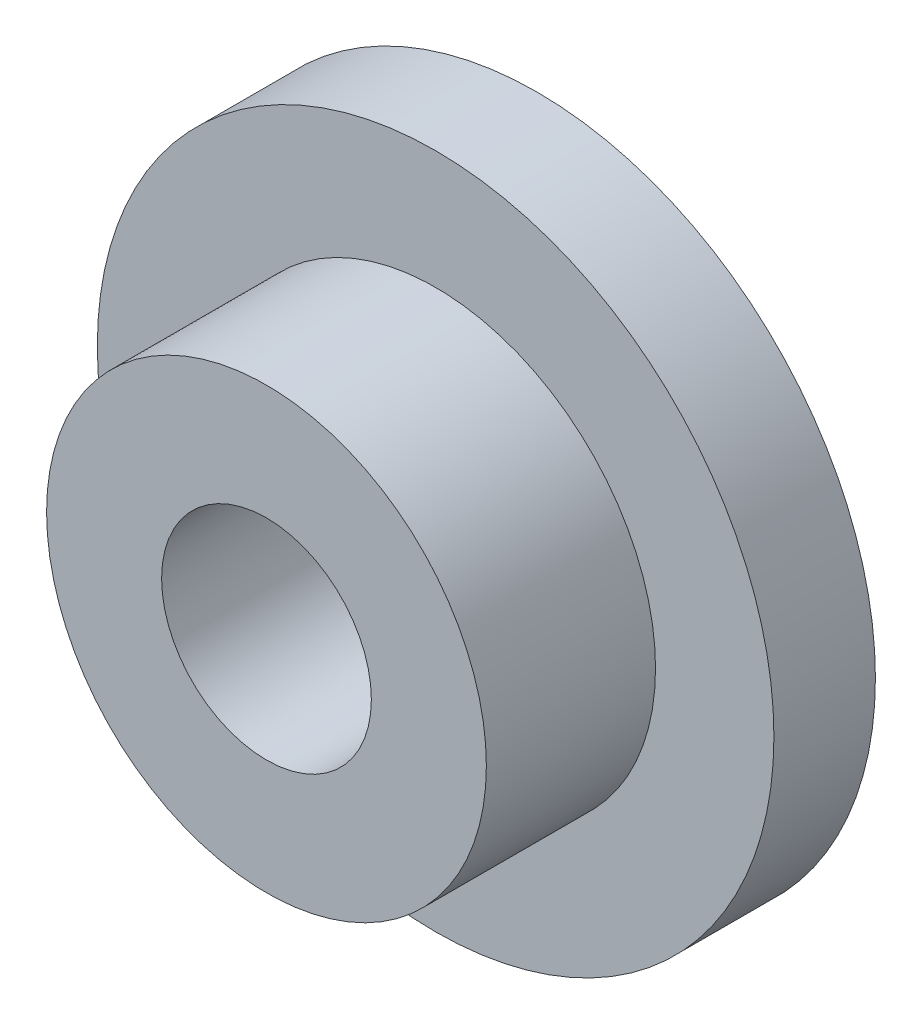
ISO-10303-21;
HEADER;
FILE_DESCRIPTION(('STEP AP214'),'2;1');
FILE_NAME('part.step','',(''),(''),'','','');
FILE_SCHEMA(('AUTOMOTIVE_DESIGN { 1 0 10303 214 1 1 1 1 }'));
ENDSEC;
DATA;
#1=APPLICATION_CONTEXT('core data for automotive mechanical design processes');
#2=APPLICATION_PROTOCOL_DEFINITION('international standard','automotive_design',2000,#1);
#3=PRODUCT_CONTEXT('',#1,'mechanical');
#4=PRODUCT('Part','Part','',(#3));
#5=PRODUCT_RELATED_PRODUCT_CATEGORY('part','',(#4));
#6=PRODUCT_DEFINITION_FORMATION('','',#4);
#7=PRODUCT_DEFINITION_CONTEXT('part definition',#1,'design');
#8=PRODUCT_DEFINITION('design','',#6,#7);
#9=PRODUCT_DEFINITION_SHAPE('','',#8);
#10=(LENGTH_UNIT() NAMED_UNIT(*) SI_UNIT(.MILLI.,.METRE.));
#11=(NAMED_UNIT(*) PLANE_ANGLE_UNIT() SI_UNIT($,.RADIAN.));
#12=(NAMED_UNIT(*) SI_UNIT($,.STERADIAN.) SOLID_ANGLE_UNIT());
#13=UNCERTAINTY_MEASURE_WITH_UNIT(LENGTH_MEASURE(1.E-05),#10,'distance_accuracy_value','');
#14=(GEOMETRIC_REPRESENTATION_CONTEXT(3) GLOBAL_UNCERTAINTY_ASSIGNED_CONTEXT((#13)) GLOBAL_UNIT_ASSIGNED_CONTEXT((#10,
#11,#12)) REPRESENTATION_CONTEXT('',''));
#15=CARTESIAN_POINT('',(0.,0.,0.));
#16=DIRECTION('',(0.,0.,1.));
#17=DIRECTION('',(1.,0.,0.));
#18=AXIS2_PLACEMENT_3D('',#15,#16,#17);
#19=CARTESIAN_POINT('',(0.,0.,1.5));
#20=DIRECTION('',(0.,0.,1.));
#21=DIRECTION('',(1.,0.,0.));
#22=AXIS2_PLACEMENT_3D('',#19,#20,#21);
#23=PLANE('',#22);
#24=CARTESIAN_POINT('',(0.,0.,1.5));
#25=DIRECTION('',(0.,0.,1.));
#26=DIRECTION('',(1.,0.,0.));
#27=AXIS2_PLACEMENT_3D('',#24,#25,#26);
#28=CIRCLE('',#27,5.);
#29=CARTESIAN_POINT('',(5.,0.,1.5));
#30=VERTEX_POINT('',#29);
#31=EDGE_CURVE('E10',#30,#30,#28,.T.);
#32=ORIENTED_EDGE('',*,*,#31,.T.);
#33=EDGE_LOOP('',(#32));
#34=FACE_BOUND('',#33,.T.);
#35=CARTESIAN_POINT('',(0.,0.,1.5));
#36=DIRECTION('',(0.,0.,1.));
#37=DIRECTION('',(1.,0.,0.));
#38=AXIS2_PLACEMENT_3D('',#35,#36,#37);
#39=CIRCLE('',#38,3.25);
#40=CARTESIAN_POINT('',(3.25,0.,1.5));
#41=VERTEX_POINT('',#40);
#42=EDGE_CURVE('E56',#41,#41,#39,.T.);
#43=ORIENTED_EDGE('',*,*,#42,.F.);
#44=EDGE_LOOP('',(#43));
#45=FACE_BOUND('',#44,.T.);
#46=ADVANCED_FACE('F37',(#34,#45),#23,.T.);
#47=CARTESIAN_POINT('',(0.,0.,0.));
#48=DIRECTION('',(0.,0.,1.));
#49=DIRECTION('',(1.,0.,0.));
#50=AXIS2_PLACEMENT_3D('',#47,#48,#49);
#51=PLANE('',#50);
#52=CARTESIAN_POINT('',(0.,0.,0.));
#53=DIRECTION('',(0.,0.,1.));
#54=DIRECTION('',(1.,0.,0.));
#55=AXIS2_PLACEMENT_3D('',#52,#53,#54);
#56=CIRCLE('',#55,5.);
#57=CARTESIAN_POINT('',(5.,0.,0.));
#58=VERTEX_POINT('',#57);
#59=EDGE_CURVE('E41',#58,#58,#56,.T.);
#60=ORIENTED_EDGE('',*,*,#59,.F.);
#61=EDGE_LOOP('',(#60));
#62=FACE_BOUND('',#61,.T.);
#63=CARTESIAN_POINT('',(0.,0.,0.));
#64=DIRECTION('',(0.,0.,1.));
#65=DIRECTION('',(1.,0.,0.));
#66=AXIS2_PLACEMENT_3D('',#63,#64,#65);
#67=CIRCLE('',#66,1.55);
#68=CARTESIAN_POINT('',(1.55,0.,0.));
#69=VERTEX_POINT('',#68);
#70=EDGE_CURVE('E50',#69,#69,#67,.T.);
#71=ORIENTED_EDGE('',*,*,#70,.T.);
#72=EDGE_LOOP('',(#71));
#73=FACE_BOUND('',#72,.T.);
#74=ADVANCED_FACE('F84',(#62,#73),#51,.F.);
#75=CARTESIAN_POINT('',(0.,0.,1.5));
#76=DIRECTION('',(0.,0.,-1.));
#77=DIRECTION('',(-1.,0.,0.));
#78=AXIS2_PLACEMENT_3D('',#75,#76,#77);
#79=CYLINDRICAL_SURFACE('',#78,5.);
#80=ORIENTED_EDGE('',*,*,#31,.F.);
#81=EDGE_LOOP('',(#80));
#82=FACE_BOUND('',#81,.T.);
#83=ORIENTED_EDGE('',*,*,#59,.T.);
#84=EDGE_LOOP('',(#83));
#85=FACE_BOUND('',#84,.T.);
#86=ADVANCED_FACE('F39',(#82,#85),#79,.T.);
#87=CARTESIAN_POINT('',(0.,0.,1.5));
#88=DIRECTION('',(0.,0.,-1.));
#89=DIRECTION('',(-1.,0.,0.));
#90=AXIS2_PLACEMENT_3D('',#87,#88,#89);
#91=CYLINDRICAL_SURFACE('',#90,1.55);
#92=ORIENTED_EDGE('',*,*,#70,.F.);
#93=EDGE_LOOP('',(#92));
#94=FACE_BOUND('',#93,.T.);
#95=CARTESIAN_POINT('',(0.,0.,4.));
#96=DIRECTION('',(0.,0.,1.));
#97=DIRECTION('',(1.,0.,0.));
#98=AXIS2_PLACEMENT_3D('',#95,#96,#97);
#99=CIRCLE('',#98,1.55);
#100=CARTESIAN_POINT('',(1.55,0.,4.));
#101=VERTEX_POINT('',#100);
#102=EDGE_CURVE('E60',#101,#101,#99,.T.);
#103=ORIENTED_EDGE('',*,*,#102,.T.);
#104=EDGE_LOOP('',(#103));
#105=FACE_BOUND('',#104,.T.);
#106=ADVANCED_FACE('F68',(#94,#105),#91,.F.);
#107=CARTESIAN_POINT('',(0.,0.,4.));
#108=DIRECTION('',(0.,0.,1.));
#109=DIRECTION('',(1.,0.,0.));
#110=AXIS2_PLACEMENT_3D('',#107,#108,#109);
#111=PLANE('',#110);
#112=CARTESIAN_POINT('',(0.,0.,4.));
#113=DIRECTION('',(0.,0.,1.));
#114=DIRECTION('',(1.,0.,0.));
#115=AXIS2_PLACEMENT_3D('',#112,#113,#114);
#116=CIRCLE('',#115,3.25);
#117=CARTESIAN_POINT('',(3.25,0.,4.));
#118=VERTEX_POINT('',#117);
#119=EDGE_CURVE('E55',#118,#118,#116,.T.);
#120=ORIENTED_EDGE('',*,*,#119,.T.);
#121=EDGE_LOOP('',(#120));
#122=FACE_BOUND('',#121,.T.);
#123=ORIENTED_EDGE('',*,*,#102,.F.);
#124=EDGE_LOOP('',(#123));
#125=FACE_BOUND('',#124,.T.);
#126=ADVANCED_FACE('F70',(#122,#125),#111,.T.);
#127=CARTESIAN_POINT('',(0.,0.,4.));
#128=DIRECTION('',(0.,0.,-1.));
#129=DIRECTION('',(-1.,0.,0.));
#130=AXIS2_PLACEMENT_3D('',#127,#128,#129);
#131=CYLINDRICAL_SURFACE('',#130,3.25);
#132=ORIENTED_EDGE('',*,*,#119,.F.);
#133=EDGE_LOOP('',(#132));
#134=FACE_BOUND('',#133,.T.);
#135=ORIENTED_EDGE('',*,*,#42,.T.);
#136=EDGE_LOOP('',(#135));
#137=FACE_BOUND('',#136,.T.);
#138=ADVANCED_FACE('F72',(#134,#137),#131,.T.);
#139=CLOSED_SHELL('',(#46,#74,#86,#106,#126,#138));
#140=MANIFOLD_SOLID_BREP('B2',#139);
#141=ADVANCED_BREP_SHAPE_REPRESENTATION('',(#18,#140),#14);
#142=SHAPE_DEFINITION_REPRESENTATION(#9,#141);
ENDSEC;
END-ISO-10303-21;
